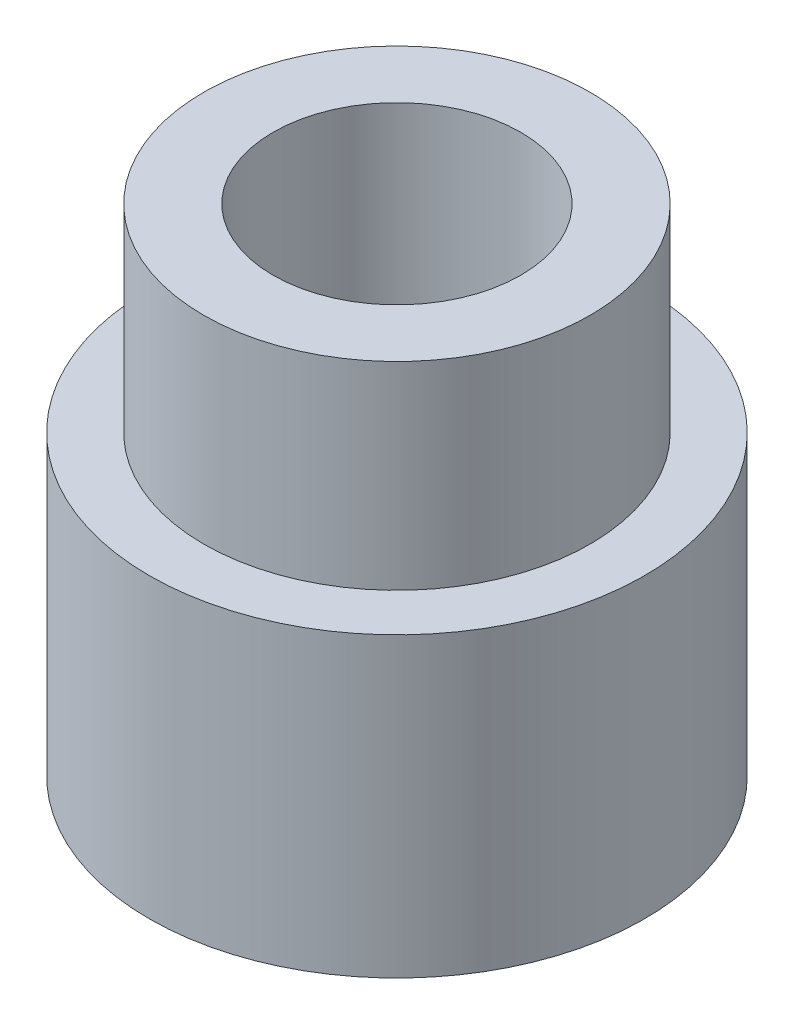
ISO-10303-21;
HEADER;
FILE_DESCRIPTION(('STEP AP214'),'2;1');
FILE_NAME('part.step','',(''),(''),'','','');
FILE_SCHEMA(('AUTOMOTIVE_DESIGN { 1 0 10303 214 1 1 1 1 }'));
ENDSEC;
DATA;
#1=APPLICATION_CONTEXT('core data for automotive mechanical design processes');
#2=APPLICATION_PROTOCOL_DEFINITION('international standard','automotive_design',2000,#1);
#3=PRODUCT_CONTEXT('',#1,'mechanical');
#4=PRODUCT('Part','Part','',(#3));
#5=PRODUCT_RELATED_PRODUCT_CATEGORY('part','',(#4));
#6=PRODUCT_DEFINITION_FORMATION('','',#4);
#7=PRODUCT_DEFINITION_CONTEXT('part definition',#1,'design');
#8=PRODUCT_DEFINITION('design','',#6,#7);
#9=PRODUCT_DEFINITION_SHAPE('','',#8);
#10=(LENGTH_UNIT() NAMED_UNIT(*) SI_UNIT(.MILLI.,.METRE.));
#11=(NAMED_UNIT(*) PLANE_ANGLE_UNIT() SI_UNIT($,.RADIAN.));
#12=(NAMED_UNIT(*) SI_UNIT($,.STERADIAN.) SOLID_ANGLE_UNIT());
#13=UNCERTAINTY_MEASURE_WITH_UNIT(LENGTH_MEASURE(1.E-05),#10,'distance_accuracy_value','');
#14=(GEOMETRIC_REPRESENTATION_CONTEXT(3) GLOBAL_UNCERTAINTY_ASSIGNED_CONTEXT((#13)) GLOBAL_UNIT_ASSIGNED_CONTEXT((#10,
#11,#12)) REPRESENTATION_CONTEXT('',''));
#15=CARTESIAN_POINT('',(0.,0.,0.));
#16=DIRECTION('',(0.,0.,1.));
#17=DIRECTION('',(1.,0.,0.));
#18=AXIS2_PLACEMENT_3D('',#15,#16,#17);
#19=CARTESIAN_POINT('',(0.,63.5,0.));
#20=DIRECTION('',(0.,-1.,0.));
#21=DIRECTION('',(0.,0.,-1.));
#22=AXIS2_PLACEMENT_3D('',#19,#20,#21);
#23=CYLINDRICAL_SURFACE('',#22,31.75);
#24=CARTESIAN_POINT('',(0.,0.,0.));
#25=DIRECTION('',(0.,1.,0.));
#26=DIRECTION('',(0.,0.,1.));
#27=AXIS2_PLACEMENT_3D('',#24,#25,#26);
#28=CIRCLE('',#27,31.75);
#29=CARTESIAN_POINT('',(0.,0.,31.75));
#30=VERTEX_POINT('',#29);
#31=EDGE_CURVE('E10',#30,#30,#28,.T.);
#32=ORIENTED_EDGE('',*,*,#31,.T.);
#33=EDGE_LOOP('',(#32));
#34=FACE_BOUND('',#33,.T.);
#35=CARTESIAN_POINT('',(0.,38.1,0.));
#36=DIRECTION('',(0.,1.,0.));
#37=DIRECTION('',(0.,0.,1.));
#38=AXIS2_PLACEMENT_3D('',#35,#36,#37);
#39=CIRCLE('',#38,31.75);
#40=CARTESIAN_POINT('',(0.,38.1,31.75));
#41=VERTEX_POINT('',#40);
#42=EDGE_CURVE('E39',#41,#41,#39,.T.);
#43=ORIENTED_EDGE('',*,*,#42,.F.);
#44=EDGE_LOOP('',(#43));
#45=FACE_BOUND('',#44,.T.);
#46=ADVANCED_FACE('F33',(#34,#45),#23,.T.);
#47=CARTESIAN_POINT('',(0.,0.,0.));
#48=DIRECTION('',(0.,1.,0.));
#49=DIRECTION('',(0.,0.,1.));
#50=AXIS2_PLACEMENT_3D('',#47,#48,#49);
#51=PLANE('',#50);
#52=CARTESIAN_POINT('',(10.16,0.,-1.06420351207939E-13));
#53=DIRECTION('',(0.,-1.,0.));
#54=DIRECTION('',(0.,0.,-1.));
#55=AXIS2_PLACEMENT_3D('',#52,#53,#54);
#56=CIRCLE('',#55,3.17499999999999);
#57=CARTESIAN_POINT('',(10.16,0.,-3.17500000000009));
#58=VERTEX_POINT('',#57);
#59=EDGE_CURVE('E85',#58,#58,#56,.T.);
#60=ORIENTED_EDGE('',*,*,#59,.F.);
#61=EDGE_LOOP('',(#60));
#62=FACE_BOUND('',#61,.T.);
#63=CARTESIAN_POINT('',(0.,0.,10.16));
#64=DIRECTION('',(0.,-1.,0.));
#65=DIRECTION('',(0.,0.,-1.));
#66=AXIS2_PLACEMENT_3D('',#63,#64,#65);
#67=CIRCLE('',#66,3.17499999999999);
#68=CARTESIAN_POINT('',(0.,0.,6.98500000000001));
#69=VERTEX_POINT('',#68);
#70=EDGE_CURVE('E79',#69,#69,#67,.T.);
#71=ORIENTED_EDGE('',*,*,#70,.F.);
#72=EDGE_LOOP('',(#71));
#73=FACE_BOUND('',#72,.T.);
#74=CARTESIAN_POINT('',(-10.16,0.,0.));
#75=DIRECTION('',(0.,-1.,0.));
#76=DIRECTION('',(0.,0.,-1.));
#77=AXIS2_PLACEMENT_3D('',#74,#75,#76);
#78=CIRCLE('',#77,3.17499999999999);
#79=CARTESIAN_POINT('',(-10.16,0.,-3.17499999999995));
#80=VERTEX_POINT('',#79);
#81=EDGE_CURVE('E73',#80,#80,#78,.T.);
#82=ORIENTED_EDGE('',*,*,#81,.F.);
#83=EDGE_LOOP('',(#82));
#84=FACE_BOUND('',#83,.T.);
#85=CARTESIAN_POINT('',(0.,0.,-10.16));
#86=DIRECTION('',(0.,-1.,0.));
#87=DIRECTION('',(0.,0.,-1.));
#88=AXIS2_PLACEMENT_3D('',#85,#86,#87);
#89=CIRCLE('',#88,3.17499999999999);
#90=CARTESIAN_POINT('',(0.,0.,-13.335));
#91=VERTEX_POINT('',#90);
#92=EDGE_CURVE('E67',#91,#91,#89,.T.);
#93=ORIENTED_EDGE('',*,*,#92,.F.);
#94=EDGE_LOOP('',(#93));
#95=FACE_BOUND('',#94,.T.);
#96=CARTESIAN_POINT('',(0.,0.,0.));
#97=DIRECTION('',(0.,-1.,0.));
#98=DIRECTION('',(0.,0.,-1.));
#99=AXIS2_PLACEMENT_3D('',#96,#97,#98);
#100=CIRCLE('',#99,3.17499999999999);
#101=CARTESIAN_POINT('',(0.,0.,-3.17499999999999));
#102=VERTEX_POINT('',#101);
#103=EDGE_CURVE('E61',#102,#102,#100,.T.);
#104=ORIENTED_EDGE('',*,*,#103,.F.);
#105=EDGE_LOOP('',(#104));
#106=FACE_BOUND('',#105,.T.);
#107=ORIENTED_EDGE('',*,*,#31,.F.);
#108=EDGE_LOOP('',(#107));
#109=FACE_BOUND('',#108,.T.);
#110=ADVANCED_FACE('F91',(#62,#73,#84,#95,#106,#109),#51,.F.);
#111=CARTESIAN_POINT('',(0.,38.1,0.));
#112=DIRECTION('',(0.,1.,0.));
#113=DIRECTION('',(0.,0.,1.));
#114=AXIS2_PLACEMENT_3D('',#111,#112,#113);
#115=PLANE('',#114);
#116=CARTESIAN_POINT('',(0.,38.1,0.));
#117=DIRECTION('',(0.,1.,0.));
#118=DIRECTION('',(0.,0.,1.));
#119=AXIS2_PLACEMENT_3D('',#116,#117,#118);
#120=CIRCLE('',#119,24.765);
#121=CARTESIAN_POINT('',(0.,38.1,24.765));
#122=VERTEX_POINT('',#121);
#123=EDGE_CURVE('E43',#122,#122,#120,.T.);
#124=ORIENTED_EDGE('',*,*,#123,.F.);
#125=EDGE_LOOP('',(#124));
#126=FACE_BOUND('',#125,.T.);
#127=ORIENTED_EDGE('',*,*,#42,.T.);
#128=EDGE_LOOP('',(#127));
#129=FACE_BOUND('',#128,.T.);
#130=ADVANCED_FACE('F94',(#126,#129),#115,.T.);
#131=CARTESIAN_POINT('',(0.,38.1,0.));
#132=DIRECTION('',(0.,1.,0.));
#133=DIRECTION('',(0.,0.,1.));
#134=AXIS2_PLACEMENT_3D('',#131,#132,#133);
#135=CYLINDRICAL_SURFACE('',#134,24.765);
#136=ORIENTED_EDGE('',*,*,#123,.T.);
#137=EDGE_LOOP('',(#136));
#138=FACE_BOUND('',#137,.T.);
#139=CARTESIAN_POINT('',(0.,63.5,0.));
#140=DIRECTION('',(0.,1.,0.));
#141=DIRECTION('',(0.,0.,1.));
#142=AXIS2_PLACEMENT_3D('',#139,#140,#141);
#143=CIRCLE('',#142,24.765);
#144=CARTESIAN_POINT('',(0.,63.5,24.765));
#145=VERTEX_POINT('',#144);
#146=EDGE_CURVE('E47',#145,#145,#143,.T.);
#147=ORIENTED_EDGE('',*,*,#146,.F.);
#148=EDGE_LOOP('',(#147));
#149=FACE_BOUND('',#148,.T.);
#150=ADVANCED_FACE('F137',(#138,#149),#135,.T.);
#151=CARTESIAN_POINT('',(0.,63.5,0.));
#152=DIRECTION('',(0.,1.,0.));
#153=DIRECTION('',(0.,0.,1.));
#154=AXIS2_PLACEMENT_3D('',#151,#152,#153);
#155=PLANE('',#154);
#156=CARTESIAN_POINT('',(0.,63.5,0.));
#157=DIRECTION('',(0.,1.,0.));
#158=DIRECTION('',(0.,0.,1.));
#159=AXIS2_PLACEMENT_3D('',#156,#157,#158);
#160=CIRCLE('',#159,15.875);
#161=CARTESIAN_POINT('',(0.,63.5,15.875));
#162=VERTEX_POINT('',#161);
#163=EDGE_CURVE('E53',#162,#162,#160,.T.);
#164=ORIENTED_EDGE('',*,*,#163,.F.);
#165=EDGE_LOOP('',(#164));
#166=FACE_BOUND('',#165,.T.);
#167=ORIENTED_EDGE('',*,*,#146,.T.);
#168=EDGE_LOOP('',(#167));
#169=FACE_BOUND('',#168,.T.);
#170=ADVANCED_FACE('F145',(#166,#169),#155,.T.);
#171=CARTESIAN_POINT('',(0.,12.7,0.));
#172=DIRECTION('',(0.,1.,0.));
#173=DIRECTION('',(0.,0.,1.));
#174=AXIS2_PLACEMENT_3D('',#171,#172,#173);
#175=CYLINDRICAL_SURFACE('',#174,15.875);
#176=CARTESIAN_POINT('',(0.,12.7,0.));
#177=DIRECTION('',(0.,1.,0.));
#178=DIRECTION('',(0.,0.,1.));
#179=AXIS2_PLACEMENT_3D('',#176,#177,#178);
#180=CIRCLE('',#179,15.875);
#181=CARTESIAN_POINT('',(0.,12.7,15.875));
#182=VERTEX_POINT('',#181);
#183=EDGE_CURVE('E51',#182,#182,#180,.T.);
#184=ORIENTED_EDGE('',*,*,#183,.F.);
#185=EDGE_LOOP('',(#184));
#186=FACE_BOUND('',#185,.T.);
#187=ORIENTED_EDGE('',*,*,#163,.T.);
#188=EDGE_LOOP('',(#187));
#189=FACE_BOUND('',#188,.T.);
#190=ADVANCED_FACE('F117',(#186,#189),#175,.F.);
#191=CARTESIAN_POINT('',(0.,12.7,0.));
#192=DIRECTION('',(0.,1.,0.));
#193=DIRECTION('',(0.,0.,1.));
#194=AXIS2_PLACEMENT_3D('',#191,#192,#193);
#195=PLANE('',#194);
#196=CARTESIAN_POINT('',(10.16,12.7,-1.06420351207939E-13));
#197=DIRECTION('',(0.,-1.,0.));
#198=DIRECTION('',(0.,0.,-1.));
#199=AXIS2_PLACEMENT_3D('',#196,#197,#198);
#200=CIRCLE('',#199,3.17499999999999);
#201=CARTESIAN_POINT('',(10.16,12.7,-3.17500000000009));
#202=VERTEX_POINT('',#201);
#203=EDGE_CURVE('E82',#202,#202,#200,.T.);
#204=ORIENTED_EDGE('',*,*,#203,.T.);
#205=EDGE_LOOP('',(#204));
#206=FACE_BOUND('',#205,.T.);
#207=CARTESIAN_POINT('',(0.,12.7,10.16));
#208=DIRECTION('',(0.,-1.,0.));
#209=DIRECTION('',(0.,0.,-1.));
#210=AXIS2_PLACEMENT_3D('',#207,#208,#209);
#211=CIRCLE('',#210,3.17499999999999);
#212=CARTESIAN_POINT('',(0.,12.7,6.98500000000001));
#213=VERTEX_POINT('',#212);
#214=EDGE_CURVE('E76',#213,#213,#211,.T.);
#215=ORIENTED_EDGE('',*,*,#214,.T.);
#216=EDGE_LOOP('',(#215));
#217=FACE_BOUND('',#216,.T.);
#218=CARTESIAN_POINT('',(-10.16,12.7,0.));
#219=DIRECTION('',(0.,-1.,0.));
#220=DIRECTION('',(0.,0.,-1.));
#221=AXIS2_PLACEMENT_3D('',#218,#219,#220);
#222=CIRCLE('',#221,3.17499999999999);
#223=CARTESIAN_POINT('',(-10.16,12.7,-3.17499999999995));
#224=VERTEX_POINT('',#223);
#225=EDGE_CURVE('E70',#224,#224,#222,.T.);
#226=ORIENTED_EDGE('',*,*,#225,.T.);
#227=EDGE_LOOP('',(#226));
#228=FACE_BOUND('',#227,.T.);
#229=CARTESIAN_POINT('',(0.,12.7,-10.16));
#230=DIRECTION('',(0.,-1.,0.));
#231=DIRECTION('',(0.,0.,-1.));
#232=AXIS2_PLACEMENT_3D('',#229,#230,#231);
#233=CIRCLE('',#232,3.17499999999999);
#234=CARTESIAN_POINT('',(0.,12.7,-13.335));
#235=VERTEX_POINT('',#234);
#236=EDGE_CURVE('E64',#235,#235,#233,.T.);
#237=ORIENTED_EDGE('',*,*,#236,.T.);
#238=EDGE_LOOP('',(#237));
#239=FACE_BOUND('',#238,.T.);
#240=CARTESIAN_POINT('',(0.,12.7,0.));
#241=DIRECTION('',(0.,-1.,0.));
#242=DIRECTION('',(0.,0.,-1.));
#243=AXIS2_PLACEMENT_3D('',#240,#241,#242);
#244=CIRCLE('',#243,3.17499999999999);
#245=CARTESIAN_POINT('',(0.,12.7,-3.17499999999999));
#246=VERTEX_POINT('',#245);
#247=EDGE_CURVE('E56',#246,#246,#244,.T.);
#248=ORIENTED_EDGE('',*,*,#247,.T.);
#249=EDGE_LOOP('',(#248));
#250=FACE_BOUND('',#249,.T.);
#251=ORIENTED_EDGE('',*,*,#183,.T.);
#252=EDGE_LOOP('',(#251));
#253=FACE_BOUND('',#252,.T.);
#254=ADVANCED_FACE('F107',(#206,#217,#228,#239,#250,#253),#195,.T.);
#255=CARTESIAN_POINT('',(0.,0.,0.));
#256=DIRECTION('',(0.,-1.,0.));
#257=DIRECTION('',(0.,0.,-1.));
#258=AXIS2_PLACEMENT_3D('',#255,#256,#257);
#259=CYLINDRICAL_SURFACE('',#258,3.17499999999999);
#260=ORIENTED_EDGE('',*,*,#247,.F.);
#261=EDGE_LOOP('',(#260));
#262=FACE_BOUND('',#261,.T.);
#263=ORIENTED_EDGE('',*,*,#103,.T.);
#264=EDGE_LOOP('',(#263));
#265=FACE_BOUND('',#264,.T.);
#266=ADVANCED_FACE('F104',(#262,#265),#259,.F.);
#267=CARTESIAN_POINT('',(0.,0.,-10.16));
#268=DIRECTION('',(0.,-1.,0.));
#269=DIRECTION('',(0.,0.,-1.));
#270=AXIS2_PLACEMENT_3D('',#267,#268,#269);
#271=CYLINDRICAL_SURFACE('',#270,3.17499999999999);
#272=ORIENTED_EDGE('',*,*,#236,.F.);
#273=EDGE_LOOP('',(#272));
#274=FACE_BOUND('',#273,.T.);
#275=ORIENTED_EDGE('',*,*,#92,.T.);
#276=EDGE_LOOP('',(#275));
#277=FACE_BOUND('',#276,.T.);
#278=ADVANCED_FACE('F106',(#274,#277),#271,.F.);
#279=CARTESIAN_POINT('',(-10.16,0.,0.));
#280=DIRECTION('',(0.,-1.,0.));
#281=DIRECTION('',(0.,0.,-1.));
#282=AXIS2_PLACEMENT_3D('',#279,#280,#281);
#283=CYLINDRICAL_SURFACE('',#282,3.17499999999999);
#284=ORIENTED_EDGE('',*,*,#225,.F.);
#285=EDGE_LOOP('',(#284));
#286=FACE_BOUND('',#285,.T.);
#287=ORIENTED_EDGE('',*,*,#81,.T.);
#288=EDGE_LOOP('',(#287));
#289=FACE_BOUND('',#288,.T.);
#290=ADVANCED_FACE('F114',(#286,#289),#283,.F.);
#291=CARTESIAN_POINT('',(0.,0.,10.16));
#292=DIRECTION('',(0.,-1.,0.));
#293=DIRECTION('',(0.,0.,-1.));
#294=AXIS2_PLACEMENT_3D('',#291,#292,#293);
#295=CYLINDRICAL_SURFACE('',#294,3.17499999999999);
#296=ORIENTED_EDGE('',*,*,#214,.F.);
#297=EDGE_LOOP('',(#296));
#298=FACE_BOUND('',#297,.T.);
#299=ORIENTED_EDGE('',*,*,#70,.T.);
#300=EDGE_LOOP('',(#299));
#301=FACE_BOUND('',#300,.T.);
#302=ADVANCED_FACE('F174',(#298,#301),#295,.F.);
#303=CARTESIAN_POINT('',(10.16,0.,-1.06420351207939E-13));
#304=DIRECTION('',(0.,-1.,0.));
#305=DIRECTION('',(0.,0.,-1.));
#306=AXIS2_PLACEMENT_3D('',#303,#304,#305);
#307=CYLINDRICAL_SURFACE('',#306,3.17499999999999);
#308=ORIENTED_EDGE('',*,*,#203,.F.);
#309=EDGE_LOOP('',(#308));
#310=FACE_BOUND('',#309,.T.);
#311=ORIENTED_EDGE('',*,*,#59,.T.);
#312=EDGE_LOOP('',(#311));
#313=FACE_BOUND('',#312,.T.);
#314=ADVANCED_FACE('F89',(#310,#313),#307,.F.);
#315=CLOSED_SHELL('',(#46,#110,#130,#150,#170,#190,#254,#266,#278,#290,#302,#314));
#316=MANIFOLD_SOLID_BREP('B2',#315);
#317=ADVANCED_BREP_SHAPE_REPRESENTATION('',(#18,#316),#14);
#318=SHAPE_DEFINITION_REPRESENTATION(#9,#317);
ENDSEC;
END-ISO-10303-21;
